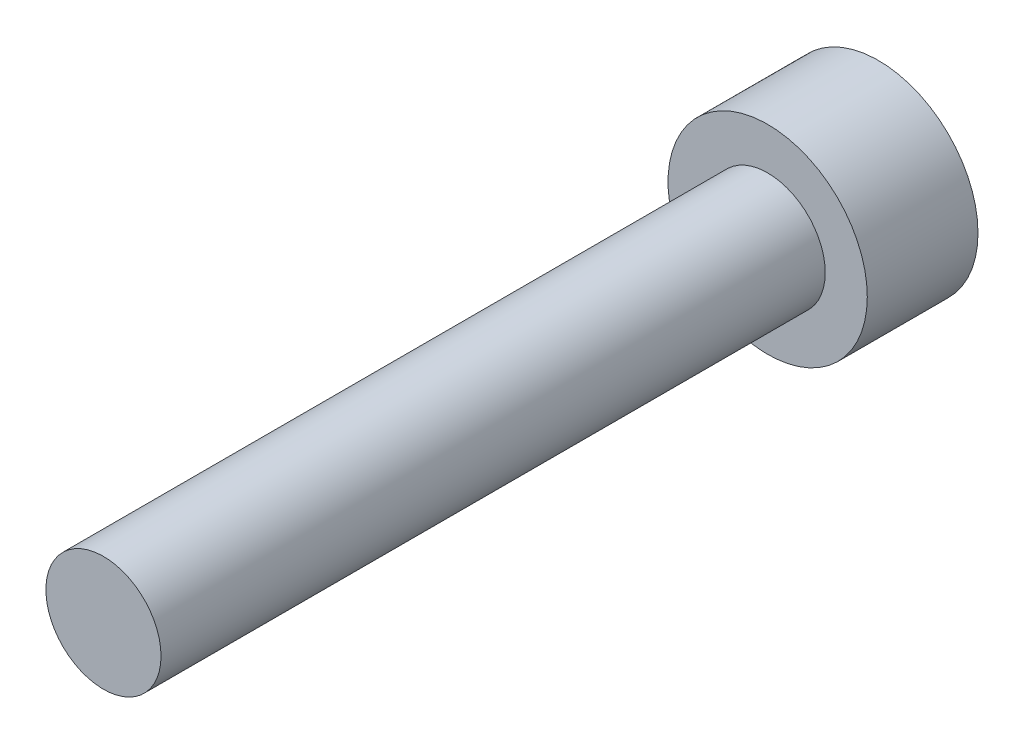
ISO-10303-21;
HEADER;
FILE_DESCRIPTION(('STEP AP214'),'2;1');
FILE_NAME('part.step','',(''),(''),'','','');
FILE_SCHEMA(('AUTOMOTIVE_DESIGN { 1 0 10303 214 1 1 1 1 }'));
ENDSEC;
DATA;
#1=APPLICATION_CONTEXT('core data for automotive mechanical design processes');
#2=APPLICATION_PROTOCOL_DEFINITION('international standard','automotive_design',2000,#1);
#3=PRODUCT_CONTEXT('',#1,'mechanical');
#4=PRODUCT('Part','Part','',(#3));
#5=PRODUCT_RELATED_PRODUCT_CATEGORY('part','',(#4));
#6=PRODUCT_DEFINITION_FORMATION('','',#4);
#7=PRODUCT_DEFINITION_CONTEXT('part definition',#1,'design');
#8=PRODUCT_DEFINITION('design','',#6,#7);
#9=PRODUCT_DEFINITION_SHAPE('','',#8);
#10=(LENGTH_UNIT() NAMED_UNIT(*) SI_UNIT(.MILLI.,.METRE.));
#11=(NAMED_UNIT(*) PLANE_ANGLE_UNIT() SI_UNIT($,.RADIAN.));
#12=(NAMED_UNIT(*) SI_UNIT($,.STERADIAN.) SOLID_ANGLE_UNIT());
#13=UNCERTAINTY_MEASURE_WITH_UNIT(LENGTH_MEASURE(1.E-05),#10,'distance_accuracy_value','');
#14=(GEOMETRIC_REPRESENTATION_CONTEXT(3) GLOBAL_UNCERTAINTY_ASSIGNED_CONTEXT((#13)) GLOBAL_UNIT_ASSIGNED_CONTEXT((#10,
#11,#12)) REPRESENTATION_CONTEXT('',''));
#15=CARTESIAN_POINT('',(0.,0.,0.));
#16=DIRECTION('',(0.,0.,1.));
#17=DIRECTION('',(1.,0.,0.));
#18=AXIS2_PLACEMENT_3D('',#15,#16,#17);
#19=CARTESIAN_POINT('',(0.,0.,2.5));
#20=DIRECTION('',(0.,0.,1.));
#21=DIRECTION('',(1.,0.,0.));
#22=AXIS2_PLACEMENT_3D('',#19,#20,#21);
#23=PLANE('',#22);
#24=CARTESIAN_POINT('',(0.,0.,2.5));
#25=DIRECTION('',(0.,0.,1.));
#26=DIRECTION('',(1.,0.,0.));
#27=AXIS2_PLACEMENT_3D('',#24,#25,#26);
#28=CIRCLE('',#27,2.25);
#29=CARTESIAN_POINT('',(2.25,0.,2.5));
#30=VERTEX_POINT('',#29);
#31=EDGE_CURVE('E11',#30,#30,#28,.T.);
#32=ORIENTED_EDGE('',*,*,#31,.T.);
#33=EDGE_LOOP('',(#32));
#34=FACE_BOUND('',#33,.T.);
#35=CARTESIAN_POINT('',(0.,0.,2.5));
#36=DIRECTION('',(0.,0.,1.));
#37=DIRECTION('',(1.,0.,0.));
#38=AXIS2_PLACEMENT_3D('',#35,#36,#37);
#39=CIRCLE('',#38,1.3);
#40=CARTESIAN_POINT('',(1.3,0.,2.5));
#41=VERTEX_POINT('',#40);
#42=EDGE_CURVE('E139',#41,#41,#39,.T.);
#43=ORIENTED_EDGE('',*,*,#42,.F.);
#44=EDGE_LOOP('',(#43));
#45=FACE_BOUND('',#44,.T.);
#46=ADVANCED_FACE('F37',(#34,#45),#23,.T.);
#47=CARTESIAN_POINT('',(0.,0.,2.5));
#48=DIRECTION('',(0.,0.,-1.));
#49=DIRECTION('',(-1.,0.,0.));
#50=AXIS2_PLACEMENT_3D('',#47,#48,#49);
#51=CYLINDRICAL_SURFACE('',#50,2.25);
#52=ORIENTED_EDGE('',*,*,#31,.F.);
#53=EDGE_LOOP('',(#52));
#54=FACE_BOUND('',#53,.T.);
#55=CARTESIAN_POINT('',(0.,0.,0.));
#56=DIRECTION('',(0.,0.,1.));
#57=DIRECTION('',(1.,0.,0.));
#58=AXIS2_PLACEMENT_3D('',#55,#56,#57);
#59=CIRCLE('',#58,2.25);
#60=CARTESIAN_POINT('',(2.25,0.,0.));
#61=VERTEX_POINT('',#60);
#62=EDGE_CURVE('E41',#61,#61,#59,.T.);
#63=ORIENTED_EDGE('',*,*,#62,.T.);
#64=EDGE_LOOP('',(#63));
#65=FACE_BOUND('',#64,.T.);
#66=ADVANCED_FACE('F39',(#54,#65),#51,.T.);
#67=CARTESIAN_POINT('',(0.,0.,0.));
#68=DIRECTION('',(0.,0.,1.));
#69=DIRECTION('',(1.,0.,0.));
#70=AXIS2_PLACEMENT_3D('',#67,#68,#69);
#71=PLANE('',#70);
#72=DIRECTION('',(-0.205557637970208,0.978645010957553,0.));
#73=VECTOR('',#72,1.);
#74=CARTESIAN_POINT('',(-0.852242502162426,-0.763657678817253,0.));
#75=LINE('',#74,#73);
#76=CARTESIAN_POINT('',(-0.852242502162426,-0.763657678817253,0.));
#77=VERTEX_POINT('',#76);
#78=CARTESIAN_POINT('',(-1.08746820073201,0.356234817648851,0.));
#79=VERTEX_POINT('',#78);
#80=EDGE_CURVE('E126',#77,#79,#75,.T.);
#81=ORIENTED_EDGE('',*,*,#80,.F.);
#82=DIRECTION('',(-0.950310259761245,0.311304369054652,0.));
#83=VECTOR('',#82,1.);
#84=CARTESIAN_POINT('',(0.235225698569587,-1.1198924964661,0.));
#85=LINE('',#84,#83);
#86=CARTESIAN_POINT('',(0.235225698569587,-1.1198924964661,0.));
#87=VERTEX_POINT('',#86);
#88=EDGE_CURVE('E52',#87,#77,#85,.T.);
#89=ORIENTED_EDGE('',*,*,#88,.F.);
#90=DIRECTION('',(-0.744752621791037,-0.667340641902901,0.));
#91=VECTOR('',#90,1.);
#92=CARTESIAN_POINT('',(1.08746820073201,-0.356234817648848,0.));
#93=LINE('',#92,#91);
#94=CARTESIAN_POINT('',(1.08746820073201,-0.356234817648848,0.));
#95=VERTEX_POINT('',#94);
#96=EDGE_CURVE('E135',#95,#87,#93,.T.);
#97=ORIENTED_EDGE('',*,*,#96,.F.);
#98=DIRECTION('',(0.205557637970207,-0.978645010957553,0.));
#99=VECTOR('',#98,1.);
#100=CARTESIAN_POINT('',(0.852242502162427,0.763657678817255,0.));
#101=LINE('',#100,#99);
#102=CARTESIAN_POINT('',(0.852242502162427,0.763657678817255,0.));
#103=VERTEX_POINT('',#102);
#104=EDGE_CURVE('E133',#103,#95,#101,.T.);
#105=ORIENTED_EDGE('',*,*,#104,.F.);
#106=DIRECTION('',(0.950310259761245,-0.311304369054652,0.));
#107=VECTOR('',#106,1.);
#108=CARTESIAN_POINT('',(-0.235225698569587,1.1198924964661,0.));
#109=LINE('',#108,#107);
#110=CARTESIAN_POINT('',(-0.235225698569587,1.1198924964661,0.));
#111=VERTEX_POINT('',#110);
#112=EDGE_CURVE('E100',#111,#103,#109,.T.);
#113=ORIENTED_EDGE('',*,*,#112,.F.);
#114=DIRECTION('',(0.744752621791037,0.667340641902901,0.));
#115=VECTOR('',#114,1.);
#116=CARTESIAN_POINT('',(-1.08746820073201,0.356234817648851,0.));
#117=LINE('',#116,#115);
#118=EDGE_CURVE('E129',#79,#111,#117,.T.);
#119=ORIENTED_EDGE('',*,*,#118,.F.);
#120=EDGE_LOOP('',(#81,#89,#97,#105,#113,#119));
#121=FACE_BOUND('',#120,.T.);
#122=ORIENTED_EDGE('',*,*,#62,.F.);
#123=EDGE_LOOP('',(#122));
#124=FACE_BOUND('',#123,.T.);
#125=ADVANCED_FACE('F159',(#121,#124),#71,.F.);
#126=CARTESIAN_POINT('',(0.,0.,17.5));
#127=DIRECTION('',(0.,0.,-1.));
#128=DIRECTION('',(-1.,0.,0.));
#129=AXIS2_PLACEMENT_3D('',#126,#127,#128);
#130=CYLINDRICAL_SURFACE('',#129,1.3);
#131=CARTESIAN_POINT('',(0.,0.,17.5));
#132=DIRECTION('',(0.,0.,1.));
#133=DIRECTION('',(1.,0.,0.));
#134=AXIS2_PLACEMENT_3D('',#131,#132,#133);
#135=CIRCLE('',#134,1.3);
#136=CARTESIAN_POINT('',(1.3,0.,17.5));
#137=VERTEX_POINT('',#136);
#138=EDGE_CURVE('E145',#137,#137,#135,.T.);
#139=ORIENTED_EDGE('',*,*,#138,.F.);
#140=EDGE_LOOP('',(#139));
#141=FACE_BOUND('',#140,.T.);
#142=ORIENTED_EDGE('',*,*,#42,.T.);
#143=EDGE_LOOP('',(#142));
#144=FACE_BOUND('',#143,.T.);
#145=ADVANCED_FACE('F151',(#141,#144),#130,.T.);
#146=CARTESIAN_POINT('',(0.,0.,17.5));
#147=DIRECTION('',(0.,0.,1.));
#148=DIRECTION('',(1.,0.,0.));
#149=AXIS2_PLACEMENT_3D('',#146,#147,#148);
#150=PLANE('',#149);
#151=ORIENTED_EDGE('',*,*,#138,.T.);
#152=EDGE_LOOP('',(#151));
#153=FACE_BOUND('',#152,.T.);
#154=ADVANCED_FACE('F168',(#153),#150,.T.);
#155=CARTESIAN_POINT('',(0.235225698569587,-1.1198924964661,2.));
#156=DIRECTION('',(-0.311304369054652,-0.950310259761245,0.));
#157=DIRECTION('',(0.950310259761245,-0.311304369054652,0.));
#158=AXIS2_PLACEMENT_3D('',#155,#156,#157);
#159=PLANE('',#158);
#160=ORIENTED_EDGE('',*,*,#88,.T.);
#161=DIRECTION('',(0.,0.,-1.));
#162=VECTOR('',#161,1.);
#163=CARTESIAN_POINT('',(-0.852242502162426,-0.763657678817253,2.));
#164=LINE('',#163,#162);
#165=CARTESIAN_POINT('',(-0.852242502162426,-0.763657678817253,2.));
#166=VERTEX_POINT('',#165);
#167=EDGE_CURVE('E82',#166,#77,#164,.T.);
#168=ORIENTED_EDGE('',*,*,#167,.F.);
#169=DIRECTION('',(-0.950310259761245,0.311304369054652,0.));
#170=VECTOR('',#169,1.);
#171=CARTESIAN_POINT('',(0.235225698569587,-1.1198924964661,2.));
#172=LINE('',#171,#170);
#173=CARTESIAN_POINT('',(0.235225698569587,-1.1198924964661,2.));
#174=VERTEX_POINT('',#173);
#175=EDGE_CURVE('E137',#174,#166,#172,.T.);
#176=ORIENTED_EDGE('',*,*,#175,.F.);
#177=DIRECTION('',(0.,0.,-1.));
#178=VECTOR('',#177,1.);
#179=CARTESIAN_POINT('',(0.235225698569587,-1.1198924964661,2.));
#180=LINE('',#179,#178);
#181=EDGE_CURVE('E60',#174,#87,#180,.T.);
#182=ORIENTED_EDGE('',*,*,#181,.T.);
#183=EDGE_LOOP('',(#160,#168,#176,#182));
#184=FACE_BOUND('',#183,.T.);
#185=ADVANCED_FACE('F180',(#184),#159,.F.);
#186=CARTESIAN_POINT('',(1.08746820073201,-0.356234817648848,2.));
#187=DIRECTION('',(0.667340641902901,-0.744752621791037,0.));
#188=DIRECTION('',(0.744752621791037,0.667340641902901,0.));
#189=AXIS2_PLACEMENT_3D('',#186,#187,#188);
#190=PLANE('',#189);
#191=ORIENTED_EDGE('',*,*,#96,.T.);
#192=ORIENTED_EDGE('',*,*,#181,.F.);
#193=DIRECTION('',(-0.744752621791037,-0.667340641902901,0.));
#194=VECTOR('',#193,1.);
#195=CARTESIAN_POINT('',(1.08746820073201,-0.356234817648848,2.));
#196=LINE('',#195,#194);
#197=CARTESIAN_POINT('',(1.08746820073201,-0.356234817648848,2.));
#198=VERTEX_POINT('',#197);
#199=EDGE_CURVE('E112',#198,#174,#196,.T.);
#200=ORIENTED_EDGE('',*,*,#199,.F.);
#201=DIRECTION('',(0.,0.,-1.));
#202=VECTOR('',#201,1.);
#203=CARTESIAN_POINT('',(1.08746820073201,-0.356234817648848,2.));
#204=LINE('',#203,#202);
#205=EDGE_CURVE('E104',#198,#95,#204,.T.);
#206=ORIENTED_EDGE('',*,*,#205,.T.);
#207=EDGE_LOOP('',(#191,#192,#200,#206));
#208=FACE_BOUND('',#207,.T.);
#209=ADVANCED_FACE('F182',(#208),#190,.F.);
#210=CARTESIAN_POINT('',(0.852242502162427,0.763657678817255,2.));
#211=DIRECTION('',(0.978645010957553,0.205557637970207,0.));
#212=DIRECTION('',(-0.205557637970207,0.978645010957553,0.));
#213=AXIS2_PLACEMENT_3D('',#210,#211,#212);
#214=PLANE('',#213);
#215=ORIENTED_EDGE('',*,*,#104,.T.);
#216=ORIENTED_EDGE('',*,*,#205,.F.);
#217=DIRECTION('',(0.205557637970207,-0.978645010957553,0.));
#218=VECTOR('',#217,1.);
#219=CARTESIAN_POINT('',(0.852242502162427,0.763657678817255,2.));
#220=LINE('',#219,#218);
#221=CARTESIAN_POINT('',(0.852242502162427,0.763657678817255,2.));
#222=VERTEX_POINT('',#221);
#223=EDGE_CURVE('E108',#222,#198,#220,.T.);
#224=ORIENTED_EDGE('',*,*,#223,.F.);
#225=DIRECTION('',(0.,0.,-1.));
#226=VECTOR('',#225,1.);
#227=CARTESIAN_POINT('',(0.852242502162427,0.763657678817255,2.));
#228=LINE('',#227,#226);
#229=EDGE_CURVE('E93',#222,#103,#228,.T.);
#230=ORIENTED_EDGE('',*,*,#229,.T.);
#231=EDGE_LOOP('',(#215,#216,#224,#230));
#232=FACE_BOUND('',#231,.T.);
#233=ADVANCED_FACE('F109',(#232),#214,.F.);
#234=CARTESIAN_POINT('',(-0.235225698569587,1.1198924964661,2.));
#235=DIRECTION('',(0.311304369054652,0.950310259761245,0.));
#236=DIRECTION('',(-0.950310259761245,0.311304369054652,0.));
#237=AXIS2_PLACEMENT_3D('',#234,#235,#236);
#238=PLANE('',#237);
#239=ORIENTED_EDGE('',*,*,#112,.T.);
#240=ORIENTED_EDGE('',*,*,#229,.F.);
#241=DIRECTION('',(0.950310259761245,-0.311304369054652,0.));
#242=VECTOR('',#241,1.);
#243=CARTESIAN_POINT('',(-0.235225698569587,1.1198924964661,2.));
#244=LINE('',#243,#242);
#245=CARTESIAN_POINT('',(-0.235225698569587,1.1198924964661,2.));
#246=VERTEX_POINT('',#245);
#247=EDGE_CURVE('E97',#246,#222,#244,.T.);
#248=ORIENTED_EDGE('',*,*,#247,.F.);
#249=DIRECTION('',(0.,0.,-1.));
#250=VECTOR('',#249,1.);
#251=CARTESIAN_POINT('',(-0.235225698569587,1.1198924964661,2.));
#252=LINE('',#251,#250);
#253=EDGE_CURVE('E105',#246,#111,#252,.T.);
#254=ORIENTED_EDGE('',*,*,#253,.T.);
#255=EDGE_LOOP('',(#239,#240,#248,#254));
#256=FACE_BOUND('',#255,.T.);
#257=ADVANCED_FACE('F95',(#256),#238,.F.);
#258=CARTESIAN_POINT('',(-1.08746820073201,0.356234817648851,2.));
#259=DIRECTION('',(-0.667340641902901,0.744752621791037,0.));
#260=DIRECTION('',(-0.744752621791038,-0.667340641902901,0.));
#261=AXIS2_PLACEMENT_3D('',#258,#259,#260);
#262=PLANE('',#261);
#263=ORIENTED_EDGE('',*,*,#118,.T.);
#264=ORIENTED_EDGE('',*,*,#253,.F.);
#265=DIRECTION('',(0.744752621791037,0.667340641902901,0.));
#266=VECTOR('',#265,1.);
#267=CARTESIAN_POINT('',(-1.08746820073201,0.356234817648851,2.));
#268=LINE('',#267,#266);
#269=CARTESIAN_POINT('',(-1.08746820073201,0.356234817648851,2.));
#270=VERTEX_POINT('',#269);
#271=EDGE_CURVE('E118',#270,#246,#268,.T.);
#272=ORIENTED_EDGE('',*,*,#271,.F.);
#273=DIRECTION('',(0.,0.,-1.));
#274=VECTOR('',#273,1.);
#275=CARTESIAN_POINT('',(-1.08746820073201,0.356234817648851,2.));
#276=LINE('',#275,#274);
#277=EDGE_CURVE('E142',#270,#79,#276,.T.);
#278=ORIENTED_EDGE('',*,*,#277,.T.);
#279=EDGE_LOOP('',(#263,#264,#272,#278));
#280=FACE_BOUND('',#279,.T.);
#281=ADVANCED_FACE('F193',(#280),#262,.F.);
#282=CARTESIAN_POINT('',(-0.852242502162426,-0.763657678817253,2.));
#283=DIRECTION('',(-0.978645010957553,-0.205557637970208,0.));
#284=DIRECTION('',(0.205557637970208,-0.978645010957553,0.));
#285=AXIS2_PLACEMENT_3D('',#282,#283,#284);
#286=PLANE('',#285);
#287=ORIENTED_EDGE('',*,*,#80,.T.);
#288=ORIENTED_EDGE('',*,*,#277,.F.);
#289=DIRECTION('',(-0.205557637970208,0.978645010957553,0.));
#290=VECTOR('',#289,1.);
#291=CARTESIAN_POINT('',(-0.852242502162426,-0.763657678817253,2.));
#292=LINE('',#291,#290);
#293=EDGE_CURVE('E120',#166,#270,#292,.T.);
#294=ORIENTED_EDGE('',*,*,#293,.F.);
#295=ORIENTED_EDGE('',*,*,#167,.T.);
#296=EDGE_LOOP('',(#287,#288,#294,#295));
#297=FACE_BOUND('',#296,.T.);
#298=ADVANCED_FACE('F178',(#297),#286,.F.);
#299=CARTESIAN_POINT('',(0.,0.,2.));
#300=DIRECTION('',(0.,0.,-1.));
#301=DIRECTION('',(-1.,0.,0.));
#302=AXIS2_PLACEMENT_3D('',#299,#300,#301);
#303=PLANE('',#302);
#304=ORIENTED_EDGE('',*,*,#175,.T.);
#305=ORIENTED_EDGE('',*,*,#293,.T.);
#306=ORIENTED_EDGE('',*,*,#271,.T.);
#307=ORIENTED_EDGE('',*,*,#247,.T.);
#308=ORIENTED_EDGE('',*,*,#223,.T.);
#309=ORIENTED_EDGE('',*,*,#199,.T.);
#310=EDGE_LOOP('',(#304,#305,#306,#307,#308,#309));
#311=FACE_BOUND('',#310,.T.);
#312=ADVANCED_FACE('F115',(#311),#303,.T.);
#313=CLOSED_SHELL('',(#46,#66,#125,#145,#154,#185,#209,#233,#257,#281,#298,#312));
#314=MANIFOLD_SOLID_BREP('B2',#313);
#315=ADVANCED_BREP_SHAPE_REPRESENTATION('',(#18,#314),#14);
#316=SHAPE_DEFINITION_REPRESENTATION(#9,#315);
ENDSEC;
END-ISO-10303-21;
